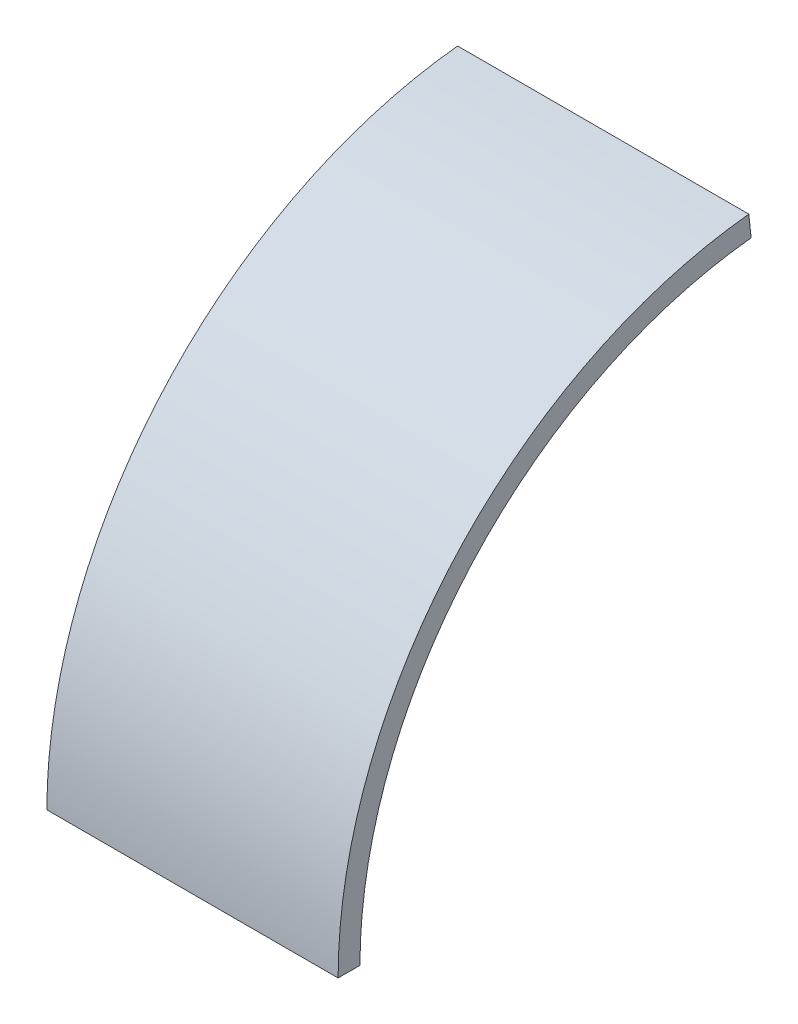
ISO-10303-21;
HEADER;
FILE_DESCRIPTION(('STEP AP214'),'2;1');
FILE_NAME('part.step','',(''),(''),'','','');
FILE_SCHEMA(('AUTOMOTIVE_DESIGN { 1 0 10303 214 1 1 1 1 }'));
ENDSEC;
DATA;
#1=APPLICATION_CONTEXT('core data for automotive mechanical design processes');
#2=APPLICATION_PROTOCOL_DEFINITION('international standard','automotive_design',2000,#1);
#3=PRODUCT_CONTEXT('',#1,'mechanical');
#4=PRODUCT('Part','Part','',(#3));
#5=PRODUCT_RELATED_PRODUCT_CATEGORY('part','',(#4));
#6=PRODUCT_DEFINITION_FORMATION('','',#4);
#7=PRODUCT_DEFINITION_CONTEXT('part definition',#1,'design');
#8=PRODUCT_DEFINITION('design','',#6,#7);
#9=PRODUCT_DEFINITION_SHAPE('','',#8);
#10=(LENGTH_UNIT() NAMED_UNIT(*) SI_UNIT(.MILLI.,.METRE.));
#11=(NAMED_UNIT(*) PLANE_ANGLE_UNIT() SI_UNIT($,.RADIAN.));
#12=(NAMED_UNIT(*) SI_UNIT($,.STERADIAN.) SOLID_ANGLE_UNIT());
#13=UNCERTAINTY_MEASURE_WITH_UNIT(LENGTH_MEASURE(1.E-05),#10,'distance_accuracy_value','');
#14=(GEOMETRIC_REPRESENTATION_CONTEXT(3) GLOBAL_UNCERTAINTY_ASSIGNED_CONTEXT((#13)) GLOBAL_UNIT_ASSIGNED_CONTEXT((#10,
#11,#12)) REPRESENTATION_CONTEXT('',''));
#15=CARTESIAN_POINT('',(0.,0.,0.));
#16=DIRECTION('',(0.,0.,1.));
#17=DIRECTION('',(1.,0.,0.));
#18=AXIS2_PLACEMENT_3D('',#15,#16,#17);
#19=CARTESIAN_POINT('',(10.,0.,0.));
#20=DIRECTION('',(-1.,0.,0.));
#21=DIRECTION('',(0.,0.,1.));
#22=AXIS2_PLACEMENT_3D('',#19,#20,#21);
#23=CYLINDRICAL_SURFACE('',#22,31.5);
#24=CARTESIAN_POINT('',(-10.,0.,0.));
#25=DIRECTION('',(1.,0.,0.));
#26=DIRECTION('',(0.,0.,-1.));
#27=AXIS2_PLACEMENT_3D('',#24,#25,#26);
#28=CIRCLE('',#27,31.5);
#29=CARTESIAN_POINT('',(-10.,31.3274397041006,3.29264659293123));
#30=VERTEX_POINT('',#29);
#31=CARTESIAN_POINT('',(-10.,0.,31.5));
#32=VERTEX_POINT('',#31);
#33=EDGE_CURVE('E115',#30,#32,#28,.T.);
#34=ORIENTED_EDGE('',*,*,#33,.T.);
#35=DIRECTION('',(-1.,0.,0.));
#36=VECTOR('',#35,1.);
#37=CARTESIAN_POINT('',(10.,0.,31.5));
#38=LINE('',#37,#36);
#39=CARTESIAN_POINT('',(10.,0.,31.5));
#40=VERTEX_POINT('',#39);
#41=EDGE_CURVE('E11',#40,#32,#38,.T.);
#42=ORIENTED_EDGE('',*,*,#41,.F.);
#43=CARTESIAN_POINT('',(10.,0.,0.));
#44=DIRECTION('',(1.,0.,0.));
#45=DIRECTION('',(0.,0.,-1.));
#46=AXIS2_PLACEMENT_3D('',#43,#44,#45);
#47=CIRCLE('',#46,31.5);
#48=CARTESIAN_POINT('',(10.,31.3274397041006,3.29264659293123));
#49=VERTEX_POINT('',#48);
#50=EDGE_CURVE('E87',#49,#40,#47,.T.);
#51=ORIENTED_EDGE('',*,*,#50,.F.);
#52=DIRECTION('',(-1.,0.,0.));
#53=VECTOR('',#52,1.);
#54=CARTESIAN_POINT('',(10.,31.3274397041006,3.29264659293123));
#55=LINE('',#54,#53);
#56=EDGE_CURVE('E63',#49,#30,#55,.T.);
#57=ORIENTED_EDGE('',*,*,#56,.T.);
#58=EDGE_LOOP('',(#34,#42,#51,#57));
#59=FACE_BOUND('',#58,.T.);
#60=ADVANCED_FACE('F46',(#59),#23,.T.);
#61=CARTESIAN_POINT('',(10.,0.,30.));
#62=DIRECTION('',(0.,-1.,0.));
#63=DIRECTION('',(0.,0.,-1.));
#64=AXIS2_PLACEMENT_3D('',#61,#62,#63);
#65=PLANE('',#64);
#66=DIRECTION('',(0.,0.,1.));
#67=VECTOR('',#66,1.);
#68=CARTESIAN_POINT('',(-10.,0.,30.));
#69=LINE('',#68,#67);
#70=CARTESIAN_POINT('',(-10.,0.,30.));
#71=VERTEX_POINT('',#70);
#72=EDGE_CURVE('E96',#71,#32,#69,.T.);
#73=ORIENTED_EDGE('',*,*,#72,.F.);
#74=DIRECTION('',(-1.,0.,0.));
#75=VECTOR('',#74,1.);
#76=CARTESIAN_POINT('',(10.,0.,30.));
#77=LINE('',#76,#75);
#78=CARTESIAN_POINT('',(10.,0.,30.));
#79=VERTEX_POINT('',#78);
#80=EDGE_CURVE('E55',#79,#71,#77,.T.);
#81=ORIENTED_EDGE('',*,*,#80,.F.);
#82=DIRECTION('',(0.,0.,1.));
#83=VECTOR('',#82,1.);
#84=CARTESIAN_POINT('',(10.,0.,30.));
#85=LINE('',#84,#83);
#86=EDGE_CURVE('E94',#79,#40,#85,.T.);
#87=ORIENTED_EDGE('',*,*,#86,.T.);
#88=ORIENTED_EDGE('',*,*,#41,.T.);
#89=EDGE_LOOP('',(#73,#81,#87,#88));
#90=FACE_BOUND('',#89,.T.);
#91=ADVANCED_FACE('F93',(#90),#65,.T.);
#92=CARTESIAN_POINT('',(10.,0.,0.));
#93=DIRECTION('',(-1.,0.,0.));
#94=DIRECTION('',(0.,0.,1.));
#95=AXIS2_PLACEMENT_3D('',#92,#93,#94);
#96=CYLINDRICAL_SURFACE('',#95,30.);
#97=CARTESIAN_POINT('',(-10.,0.,0.));
#98=DIRECTION('',(1.,0.,0.));
#99=DIRECTION('',(0.,0.,-1.));
#100=AXIS2_PLACEMENT_3D('',#97,#98,#99);
#101=CIRCLE('',#100,30.);
#102=CARTESIAN_POINT('',(-10.,29.8356568610482,3.13585389802974));
#103=VERTEX_POINT('',#102);
#104=EDGE_CURVE('E120',#103,#71,#101,.T.);
#105=ORIENTED_EDGE('',*,*,#104,.F.);
#106=DIRECTION('',(-1.,0.,0.));
#107=VECTOR('',#106,1.);
#108=CARTESIAN_POINT('',(10.,29.8356568610482,3.13585389802974));
#109=LINE('',#108,#107);
#110=CARTESIAN_POINT('',(10.,29.8356568610482,3.13585389802974));
#111=VERTEX_POINT('',#110);
#112=EDGE_CURVE('E76',#111,#103,#109,.T.);
#113=ORIENTED_EDGE('',*,*,#112,.F.);
#114=CARTESIAN_POINT('',(10.,0.,0.));
#115=DIRECTION('',(1.,0.,0.));
#116=DIRECTION('',(0.,0.,-1.));
#117=AXIS2_PLACEMENT_3D('',#114,#115,#116);
#118=CIRCLE('',#117,30.);
#119=EDGE_CURVE('E103',#111,#79,#118,.T.);
#120=ORIENTED_EDGE('',*,*,#119,.T.);
#121=ORIENTED_EDGE('',*,*,#80,.T.);
#122=EDGE_LOOP('',(#105,#113,#120,#121));
#123=FACE_BOUND('',#122,.T.);
#124=ADVANCED_FACE('F106',(#123),#96,.F.);
#125=CARTESIAN_POINT('',(10.,31.3274397041006,3.29264659293123));
#126=DIRECTION('',(0.,0.104528463267658,-0.994521895368273));
#127=DIRECTION('',(0.,0.994521895368273,0.104528463267658));
#128=AXIS2_PLACEMENT_3D('',#125,#126,#127);
#129=PLANE('',#128);
#130=DIRECTION('',(0.,-0.994521895368273,-0.104528463267658));
#131=VECTOR('',#130,1.);
#132=CARTESIAN_POINT('',(-10.,31.3274397041006,3.29264659293123));
#133=LINE('',#132,#131);
#134=EDGE_CURVE('E123',#30,#103,#133,.T.);
#135=ORIENTED_EDGE('',*,*,#134,.F.);
#136=ORIENTED_EDGE('',*,*,#56,.F.);
#137=DIRECTION('',(0.,-0.994521895368273,-0.104528463267658));
#138=VECTOR('',#137,1.);
#139=CARTESIAN_POINT('',(10.,31.3274397041006,3.29264659293123));
#140=LINE('',#139,#138);
#141=EDGE_CURVE('E108',#49,#111,#140,.T.);
#142=ORIENTED_EDGE('',*,*,#141,.T.);
#143=ORIENTED_EDGE('',*,*,#112,.T.);
#144=EDGE_LOOP('',(#135,#136,#142,#143));
#145=FACE_BOUND('',#144,.T.);
#146=ADVANCED_FACE('F141',(#145),#129,.T.);
#147=CARTESIAN_POINT('',(10.,0.,0.));
#148=DIRECTION('',(1.,0.,0.));
#149=DIRECTION('',(0.,0.,-1.));
#150=AXIS2_PLACEMENT_3D('',#147,#148,#149);
#151=PLANE('',#150);
#152=ORIENTED_EDGE('',*,*,#50,.T.);
#153=ORIENTED_EDGE('',*,*,#86,.F.);
#154=ORIENTED_EDGE('',*,*,#119,.F.);
#155=ORIENTED_EDGE('',*,*,#141,.F.);
#156=EDGE_LOOP('',(#152,#153,#154,#155));
#157=FACE_BOUND('',#156,.T.);
#158=ADVANCED_FACE('F102',(#157),#151,.T.);
#159=CARTESIAN_POINT('',(-10.,0.,0.));
#160=DIRECTION('',(1.,0.,0.));
#161=DIRECTION('',(0.,0.,-1.));
#162=AXIS2_PLACEMENT_3D('',#159,#160,#161);
#163=PLANE('',#162);
#164=ORIENTED_EDGE('',*,*,#33,.F.);
#165=ORIENTED_EDGE('',*,*,#134,.T.);
#166=ORIENTED_EDGE('',*,*,#104,.T.);
#167=ORIENTED_EDGE('',*,*,#72,.T.);
#168=EDGE_LOOP('',(#164,#165,#166,#167));
#169=FACE_BOUND('',#168,.T.);
#170=ADVANCED_FACE('F140',(#169),#163,.F.);
#171=CLOSED_SHELL('',(#60,#91,#124,#146,#158,#170));
#172=MANIFOLD_SOLID_BREP('B2',#171);
#173=ADVANCED_BREP_SHAPE_REPRESENTATION('',(#18,#172),#14);
#174=SHAPE_DEFINITION_REPRESENTATION(#9,#173);
ENDSEC;
END-ISO-10303-21;
